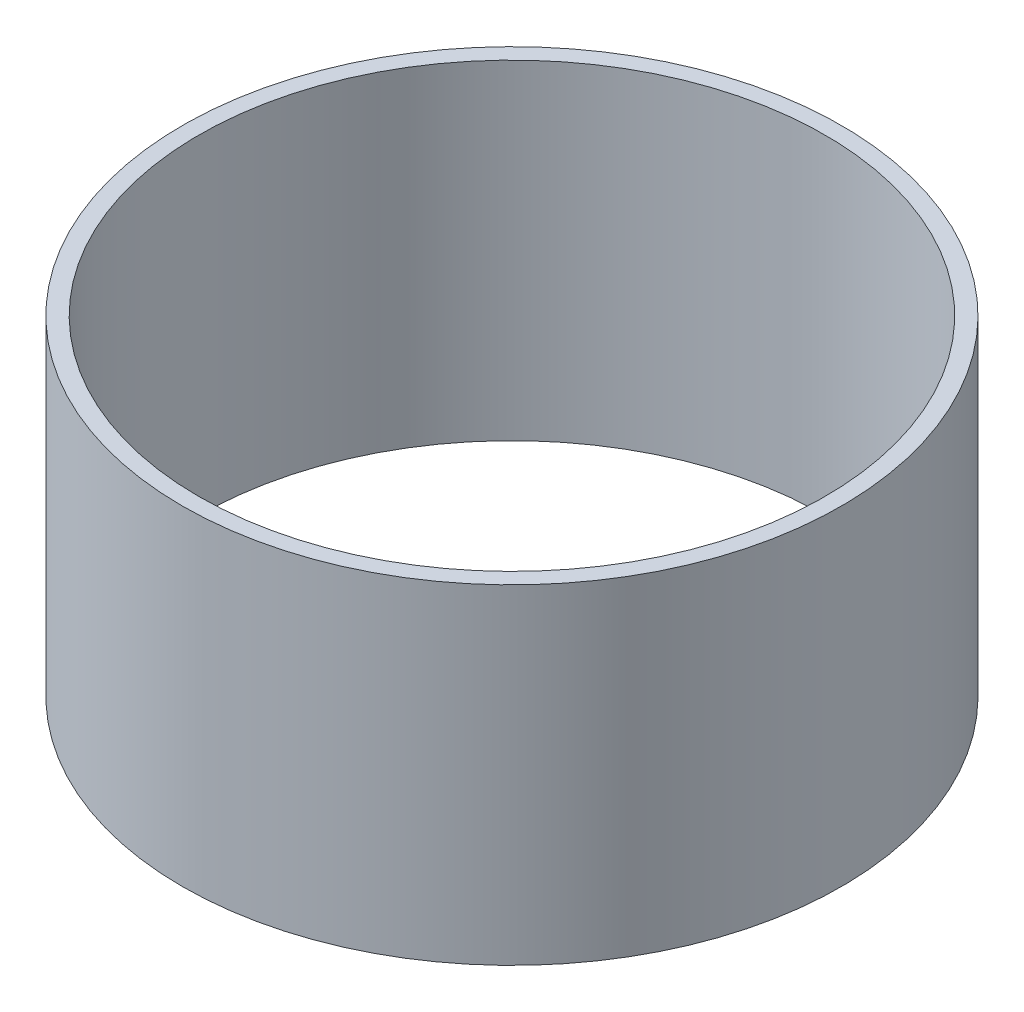
ISO-10303-21;
HEADER;
FILE_DESCRIPTION(('STEP AP214'),'2;1');
FILE_NAME('part.step','',(''),(''),'','','');
FILE_SCHEMA(('AUTOMOTIVE_DESIGN { 1 0 10303 214 1 1 1 1 }'));
ENDSEC;
DATA;
#1=APPLICATION_CONTEXT('core data for automotive mechanical design processes');
#2=APPLICATION_PROTOCOL_DEFINITION('international standard','automotive_design',2000,#1);
#3=PRODUCT_CONTEXT('',#1,'mechanical');
#4=PRODUCT('Part','Part','',(#3));
#5=PRODUCT_RELATED_PRODUCT_CATEGORY('part','',(#4));
#6=PRODUCT_DEFINITION_FORMATION('','',#4);
#7=PRODUCT_DEFINITION_CONTEXT('part definition',#1,'design');
#8=PRODUCT_DEFINITION('design','',#6,#7);
#9=PRODUCT_DEFINITION_SHAPE('','',#8);
#10=(LENGTH_UNIT() NAMED_UNIT(*) SI_UNIT(.MILLI.,.METRE.));
#11=(NAMED_UNIT(*) PLANE_ANGLE_UNIT() SI_UNIT($,.RADIAN.));
#12=(NAMED_UNIT(*) SI_UNIT($,.STERADIAN.) SOLID_ANGLE_UNIT());
#13=UNCERTAINTY_MEASURE_WITH_UNIT(LENGTH_MEASURE(1.E-05),#10,'distance_accuracy_value','');
#14=(GEOMETRIC_REPRESENTATION_CONTEXT(3) GLOBAL_UNCERTAINTY_ASSIGNED_CONTEXT((#13)) GLOBAL_UNIT_ASSIGNED_CONTEXT((#10,
#11,#12)) REPRESENTATION_CONTEXT('',''));
#15=CARTESIAN_POINT('',(0.,0.,0.));
#16=DIRECTION('',(0.,0.,1.));
#17=DIRECTION('',(1.,0.,0.));
#18=AXIS2_PLACEMENT_3D('',#15,#16,#17);
#19=CARTESIAN_POINT('',(0.,400.,0.));
#20=DIRECTION('',(0.,1.,0.));
#21=DIRECTION('',(0.,0.,1.));
#22=AXIS2_PLACEMENT_3D('',#19,#20,#21);
#23=PLANE('',#22);
#24=CARTESIAN_POINT('',(0.,400.,0.));
#25=DIRECTION('',(0.,1.,0.));
#26=DIRECTION('',(0.,0.,1.));
#27=AXIS2_PLACEMENT_3D('',#24,#25,#26);
#28=CIRCLE('',#27,400.);
#29=CARTESIAN_POINT('',(0.,400.,400.));
#30=VERTEX_POINT('',#29);
#31=EDGE_CURVE('E10',#30,#30,#28,.T.);
#32=ORIENTED_EDGE('',*,*,#31,.T.);
#33=EDGE_LOOP('',(#32));
#34=FACE_BOUND('',#33,.T.);
#35=CARTESIAN_POINT('',(0.,400.,0.));
#36=DIRECTION('',(0.,1.,0.));
#37=DIRECTION('',(0.,0.,1.));
#38=AXIS2_PLACEMENT_3D('',#35,#36,#37);
#39=CIRCLE('',#38,380.);
#40=CARTESIAN_POINT('',(0.,400.,380.));
#41=VERTEX_POINT('',#40);
#42=EDGE_CURVE('E48',#41,#41,#39,.T.);
#43=ORIENTED_EDGE('',*,*,#42,.F.);
#44=EDGE_LOOP('',(#43));
#45=FACE_BOUND('',#44,.T.);
#46=ADVANCED_FACE('F37',(#34,#45),#23,.T.);
#47=CARTESIAN_POINT('',(0.,0.,0.));
#48=DIRECTION('',(0.,1.,0.));
#49=DIRECTION('',(0.,0.,1.));
#50=AXIS2_PLACEMENT_3D('',#47,#48,#49);
#51=PLANE('',#50);
#52=CARTESIAN_POINT('',(0.,0.,0.));
#53=DIRECTION('',(0.,1.,0.));
#54=DIRECTION('',(0.,0.,1.));
#55=AXIS2_PLACEMENT_3D('',#52,#53,#54);
#56=CIRCLE('',#55,400.);
#57=CARTESIAN_POINT('',(0.,0.,400.));
#58=VERTEX_POINT('',#57);
#59=EDGE_CURVE('E41',#58,#58,#56,.T.);
#60=ORIENTED_EDGE('',*,*,#59,.F.);
#61=EDGE_LOOP('',(#60));
#62=FACE_BOUND('',#61,.T.);
#63=CARTESIAN_POINT('',(0.,0.,0.));
#64=DIRECTION('',(0.,1.,0.));
#65=DIRECTION('',(0.,0.,1.));
#66=AXIS2_PLACEMENT_3D('',#63,#64,#65);
#67=CIRCLE('',#66,380.);
#68=CARTESIAN_POINT('',(0.,0.,380.));
#69=VERTEX_POINT('',#68);
#70=EDGE_CURVE('E50',#69,#69,#67,.T.);
#71=ORIENTED_EDGE('',*,*,#70,.T.);
#72=EDGE_LOOP('',(#71));
#73=FACE_BOUND('',#72,.T.);
#74=ADVANCED_FACE('F60',(#62,#73),#51,.F.);
#75=CARTESIAN_POINT('',(0.,400.,0.));
#76=DIRECTION('',(0.,-1.,0.));
#77=DIRECTION('',(0.,0.,-1.));
#78=AXIS2_PLACEMENT_3D('',#75,#76,#77);
#79=CYLINDRICAL_SURFACE('',#78,400.);
#80=ORIENTED_EDGE('',*,*,#31,.F.);
#81=EDGE_LOOP('',(#80));
#82=FACE_BOUND('',#81,.T.);
#83=ORIENTED_EDGE('',*,*,#59,.T.);
#84=EDGE_LOOP('',(#83));
#85=FACE_BOUND('',#84,.T.);
#86=ADVANCED_FACE('F39',(#82,#85),#79,.T.);
#87=CARTESIAN_POINT('',(0.,400.,0.));
#88=DIRECTION('',(0.,-1.,0.));
#89=DIRECTION('',(0.,0.,-1.));
#90=AXIS2_PLACEMENT_3D('',#87,#88,#89);
#91=CYLINDRICAL_SURFACE('',#90,380.);
#92=ORIENTED_EDGE('',*,*,#42,.T.);
#93=EDGE_LOOP('',(#92));
#94=FACE_BOUND('',#93,.T.);
#95=ORIENTED_EDGE('',*,*,#70,.F.);
#96=EDGE_LOOP('',(#95));
#97=FACE_BOUND('',#96,.T.);
#98=ADVANCED_FACE('F56',(#94,#97),#91,.F.);
#99=CLOSED_SHELL('',(#46,#74,#86,#98));
#100=MANIFOLD_SOLID_BREP('B2',#99);
#101=ADVANCED_BREP_SHAPE_REPRESENTATION('',(#18,#100),#14);
#102=SHAPE_DEFINITION_REPRESENTATION(#9,#101);
ENDSEC;
END-ISO-10303-21;
